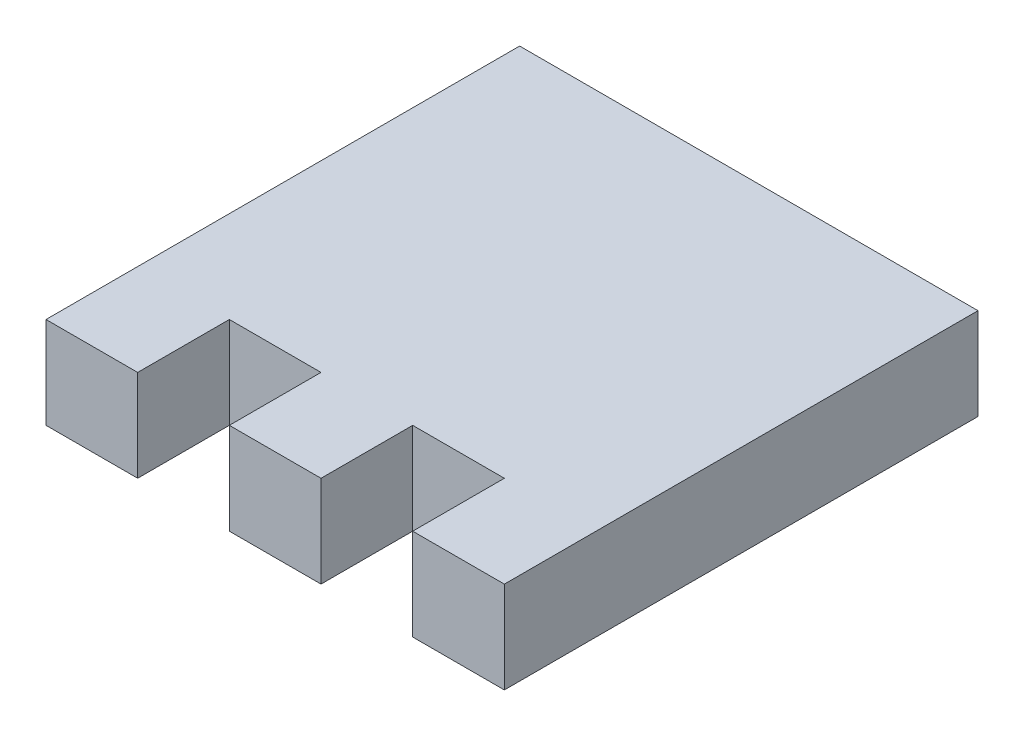
ISO-10303-21;
HEADER;
FILE_DESCRIPTION(('STEP AP214'),'2;1');
FILE_NAME('part.step','',(''),(''),'','','');
FILE_SCHEMA(('AUTOMOTIVE_DESIGN { 1 0 10303 214 1 1 1 1 }'));
ENDSEC;
DATA;
#1=APPLICATION_CONTEXT('core data for automotive mechanical design processes');
#2=APPLICATION_PROTOCOL_DEFINITION('international standard','automotive_design',2000,#1);
#3=PRODUCT_CONTEXT('',#1,'mechanical');
#4=PRODUCT('Part','Part','',(#3));
#5=PRODUCT_RELATED_PRODUCT_CATEGORY('part','',(#4));
#6=PRODUCT_DEFINITION_FORMATION('','',#4);
#7=PRODUCT_DEFINITION_CONTEXT('part definition',#1,'design');
#8=PRODUCT_DEFINITION('design','',#6,#7);
#9=PRODUCT_DEFINITION_SHAPE('','',#8);
#10=(LENGTH_UNIT() NAMED_UNIT(*) SI_UNIT(.MILLI.,.METRE.));
#11=(NAMED_UNIT(*) PLANE_ANGLE_UNIT() SI_UNIT($,.RADIAN.));
#12=(NAMED_UNIT(*) SI_UNIT($,.STERADIAN.) SOLID_ANGLE_UNIT());
#13=UNCERTAINTY_MEASURE_WITH_UNIT(LENGTH_MEASURE(1.E-05),#10,'distance_accuracy_value','');
#14=(GEOMETRIC_REPRESENTATION_CONTEXT(3) GLOBAL_UNCERTAINTY_ASSIGNED_CONTEXT((#13)) GLOBAL_UNIT_ASSIGNED_CONTEXT((#10,
#11,#12)) REPRESENTATION_CONTEXT('',''));
#15=CARTESIAN_POINT('',(0.,0.,0.));
#16=DIRECTION('',(0.,0.,1.));
#17=DIRECTION('',(1.,0.,0.));
#18=AXIS2_PLACEMENT_3D('',#15,#16,#17);
#19=CARTESIAN_POINT('',(7.5,3.,7.75));
#20=DIRECTION('',(-1.,0.,0.));
#21=DIRECTION('',(0.,0.,1.));
#22=AXIS2_PLACEMENT_3D('',#19,#20,#21);
#23=PLANE('',#22);
#24=DIRECTION('',(0.,0.,-1.));
#25=VECTOR('',#24,1.);
#26=CARTESIAN_POINT('',(7.5,0.,7.75));
#27=LINE('',#26,#25);
#28=CARTESIAN_POINT('',(7.5,0.,7.75));
#29=VERTEX_POINT('',#28);
#30=CARTESIAN_POINT('',(7.5,0.,-7.75));
#31=VERTEX_POINT('',#30);
#32=EDGE_CURVE('E156',#29,#31,#27,.T.);
#33=ORIENTED_EDGE('',*,*,#32,.T.);
#34=DIRECTION('',(0.,-1.,0.));
#35=VECTOR('',#34,1.);
#36=CARTESIAN_POINT('',(7.5,3.,-7.75));
#37=LINE('',#36,#35);
#38=CARTESIAN_POINT('',(7.5,3.,-7.75));
#39=VERTEX_POINT('',#38);
#40=EDGE_CURVE('E11',#39,#31,#37,.T.);
#41=ORIENTED_EDGE('',*,*,#40,.F.);
#42=DIRECTION('',(0.,0.,-1.));
#43=VECTOR('',#42,1.);
#44=CARTESIAN_POINT('',(7.5,3.,7.75));
#45=LINE('',#44,#43);
#46=CARTESIAN_POINT('',(7.5,3.,7.75));
#47=VERTEX_POINT('',#46);
#48=EDGE_CURVE('E178',#47,#39,#45,.T.);
#49=ORIENTED_EDGE('',*,*,#48,.F.);
#50=DIRECTION('',(0.,-1.,0.));
#51=VECTOR('',#50,1.);
#52=CARTESIAN_POINT('',(7.5,3.,7.75));
#53=LINE('',#52,#51);
#54=EDGE_CURVE('E152',#47,#29,#53,.T.);
#55=ORIENTED_EDGE('',*,*,#54,.T.);
#56=EDGE_LOOP('',(#33,#41,#49,#55));
#57=FACE_BOUND('',#56,.T.);
#58=ADVANCED_FACE('F36',(#57),#23,.F.);
#59=CARTESIAN_POINT('',(-7.5,3.,-7.75));
#60=DIRECTION('',(0.,0.,1.));
#61=DIRECTION('',(1.,0.,0.));
#62=AXIS2_PLACEMENT_3D('',#59,#60,#61);
#63=PLANE('',#62);
#64=DIRECTION('',(-1.,0.,0.));
#65=VECTOR('',#64,1.);
#66=CARTESIAN_POINT('',(-7.5,0.,-7.75));
#67=LINE('',#66,#65);
#68=CARTESIAN_POINT('',(-7.5,0.,-7.75));
#69=VERTEX_POINT('',#68);
#70=EDGE_CURVE('E159',#31,#69,#67,.T.);
#71=ORIENTED_EDGE('',*,*,#70,.T.);
#72=DIRECTION('',(0.,-1.,0.));
#73=VECTOR('',#72,1.);
#74=CARTESIAN_POINT('',(-7.5,3.,-7.75));
#75=LINE('',#74,#73);
#76=CARTESIAN_POINT('',(-7.5,3.,-7.75));
#77=VERTEX_POINT('',#76);
#78=EDGE_CURVE('E44',#77,#69,#75,.T.);
#79=ORIENTED_EDGE('',*,*,#78,.F.);
#80=DIRECTION('',(-1.,0.,0.));
#81=VECTOR('',#80,1.);
#82=CARTESIAN_POINT('',(-7.5,3.,-7.75));
#83=LINE('',#82,#81);
#84=EDGE_CURVE('E107',#39,#77,#83,.T.);
#85=ORIENTED_EDGE('',*,*,#84,.F.);
#86=ORIENTED_EDGE('',*,*,#40,.T.);
#87=EDGE_LOOP('',(#71,#79,#85,#86));
#88=FACE_BOUND('',#87,.T.);
#89=ADVANCED_FACE('F256',(#88),#63,.F.);
#90=CARTESIAN_POINT('',(-7.5,3.,7.75));
#91=DIRECTION('',(1.,0.,0.));
#92=DIRECTION('',(0.,0.,-1.));
#93=AXIS2_PLACEMENT_3D('',#90,#91,#92);
#94=PLANE('',#93);
#95=DIRECTION('',(0.,0.,1.));
#96=VECTOR('',#95,1.);
#97=CARTESIAN_POINT('',(-7.5,0.,7.75));
#98=LINE('',#97,#96);
#99=CARTESIAN_POINT('',(-7.5,0.,7.75));
#100=VERTEX_POINT('',#99);
#101=EDGE_CURVE('E161',#69,#100,#98,.T.);
#102=ORIENTED_EDGE('',*,*,#101,.T.);
#103=DIRECTION('',(0.,-1.,0.));
#104=VECTOR('',#103,1.);
#105=CARTESIAN_POINT('',(-7.5,3.,7.75));
#106=LINE('',#105,#104);
#107=CARTESIAN_POINT('',(-7.5,3.,7.75));
#108=VERTEX_POINT('',#107);
#109=EDGE_CURVE('E197',#108,#100,#106,.T.);
#110=ORIENTED_EDGE('',*,*,#109,.F.);
#111=DIRECTION('',(0.,0.,1.));
#112=VECTOR('',#111,1.);
#113=CARTESIAN_POINT('',(-7.5,3.,7.75));
#114=LINE('',#113,#112);
#115=EDGE_CURVE('E205',#77,#108,#114,.T.);
#116=ORIENTED_EDGE('',*,*,#115,.F.);
#117=ORIENTED_EDGE('',*,*,#78,.T.);
#118=EDGE_LOOP('',(#102,#110,#116,#117));
#119=FACE_BOUND('',#118,.T.);
#120=ADVANCED_FACE('F203',(#119),#94,.F.);
#121=CARTESIAN_POINT('',(-7.5,3.,7.75));
#122=DIRECTION('',(0.,0.,-1.));
#123=DIRECTION('',(-1.,0.,0.));
#124=AXIS2_PLACEMENT_3D('',#121,#122,#123);
#125=PLANE('',#124);
#126=DIRECTION('',(1.,0.,0.));
#127=VECTOR('',#126,1.);
#128=CARTESIAN_POINT('',(-7.5,0.,7.75));
#129=LINE('',#128,#127);
#130=CARTESIAN_POINT('',(-4.5,0.,7.75));
#131=VERTEX_POINT('',#130);
#132=EDGE_CURVE('E163',#100,#131,#129,.T.);
#133=ORIENTED_EDGE('',*,*,#132,.T.);
#134=DIRECTION('',(0.,-1.,0.));
#135=VECTOR('',#134,1.);
#136=CARTESIAN_POINT('',(-4.5,3.,7.75));
#137=LINE('',#136,#135);
#138=CARTESIAN_POINT('',(-4.5,3.,7.75));
#139=VERTEX_POINT('',#138);
#140=EDGE_CURVE('E194',#139,#131,#137,.T.);
#141=ORIENTED_EDGE('',*,*,#140,.F.);
#142=DIRECTION('',(1.,0.,0.));
#143=VECTOR('',#142,1.);
#144=CARTESIAN_POINT('',(-7.5,3.,7.75));
#145=LINE('',#144,#143);
#146=EDGE_CURVE('E223',#108,#139,#145,.T.);
#147=ORIENTED_EDGE('',*,*,#146,.F.);
#148=ORIENTED_EDGE('',*,*,#109,.T.);
#149=EDGE_LOOP('',(#133,#141,#147,#148));
#150=FACE_BOUND('',#149,.T.);
#151=ADVANCED_FACE('F214',(#150),#125,.F.);
#152=CARTESIAN_POINT('',(-4.5,3.,7.75));
#153=DIRECTION('',(-1.,0.,0.));
#154=DIRECTION('',(0.,0.,1.));
#155=AXIS2_PLACEMENT_3D('',#152,#153,#154);
#156=PLANE('',#155);
#157=DIRECTION('',(0.,0.,-1.));
#158=VECTOR('',#157,1.);
#159=CARTESIAN_POINT('',(-4.5,0.,7.75));
#160=LINE('',#159,#158);
#161=CARTESIAN_POINT('',(-4.5,0.,4.75));
#162=VERTEX_POINT('',#161);
#163=EDGE_CURVE('E165',#131,#162,#160,.T.);
#164=ORIENTED_EDGE('',*,*,#163,.T.);
#165=DIRECTION('',(0.,-1.,0.));
#166=VECTOR('',#165,1.);
#167=CARTESIAN_POINT('',(-4.5,3.,4.75));
#168=LINE('',#167,#166);
#169=CARTESIAN_POINT('',(-4.5,3.,4.75));
#170=VERTEX_POINT('',#169);
#171=EDGE_CURVE('E191',#170,#162,#168,.T.);
#172=ORIENTED_EDGE('',*,*,#171,.F.);
#173=DIRECTION('',(0.,0.,-1.));
#174=VECTOR('',#173,1.);
#175=CARTESIAN_POINT('',(-4.5,3.,7.75));
#176=LINE('',#175,#174);
#177=EDGE_CURVE('E220',#139,#170,#176,.T.);
#178=ORIENTED_EDGE('',*,*,#177,.F.);
#179=ORIENTED_EDGE('',*,*,#140,.T.);
#180=EDGE_LOOP('',(#164,#172,#178,#179));
#181=FACE_BOUND('',#180,.T.);
#182=ADVANCED_FACE('F218',(#181),#156,.F.);
#183=CARTESIAN_POINT('',(-4.5,3.,4.75));
#184=DIRECTION('',(0.,0.,-1.));
#185=DIRECTION('',(-1.,0.,0.));
#186=AXIS2_PLACEMENT_3D('',#183,#184,#185);
#187=PLANE('',#186);
#188=DIRECTION('',(1.,0.,0.));
#189=VECTOR('',#188,1.);
#190=CARTESIAN_POINT('',(-4.5,0.,4.75));
#191=LINE('',#190,#189);
#192=CARTESIAN_POINT('',(-1.5,0.,4.75));
#193=VERTEX_POINT('',#192);
#194=EDGE_CURVE('E167',#162,#193,#191,.T.);
#195=ORIENTED_EDGE('',*,*,#194,.T.);
#196=DIRECTION('',(0.,-1.,0.));
#197=VECTOR('',#196,1.);
#198=CARTESIAN_POINT('',(-1.5,3.,4.75));
#199=LINE('',#198,#197);
#200=CARTESIAN_POINT('',(-1.5,3.,4.75));
#201=VERTEX_POINT('',#200);
#202=EDGE_CURVE('E188',#201,#193,#199,.T.);
#203=ORIENTED_EDGE('',*,*,#202,.F.);
#204=DIRECTION('',(1.,0.,0.));
#205=VECTOR('',#204,1.);
#206=CARTESIAN_POINT('',(-4.5,3.,4.75));
#207=LINE('',#206,#205);
#208=EDGE_CURVE('E222',#170,#201,#207,.T.);
#209=ORIENTED_EDGE('',*,*,#208,.F.);
#210=ORIENTED_EDGE('',*,*,#171,.T.);
#211=EDGE_LOOP('',(#195,#203,#209,#210));
#212=FACE_BOUND('',#211,.T.);
#213=ADVANCED_FACE('F269',(#212),#187,.F.);
#214=CARTESIAN_POINT('',(-1.5,3.,7.75));
#215=DIRECTION('',(1.,0.,0.));
#216=DIRECTION('',(0.,0.,-1.));
#217=AXIS2_PLACEMENT_3D('',#214,#215,#216);
#218=PLANE('',#217);
#219=DIRECTION('',(0.,0.,1.));
#220=VECTOR('',#219,1.);
#221=CARTESIAN_POINT('',(-1.5,0.,7.75));
#222=LINE('',#221,#220);
#223=CARTESIAN_POINT('',(-1.5,0.,7.75));
#224=VERTEX_POINT('',#223);
#225=EDGE_CURVE('E169',#193,#224,#222,.T.);
#226=ORIENTED_EDGE('',*,*,#225,.T.);
#227=DIRECTION('',(0.,-1.,0.));
#228=VECTOR('',#227,1.);
#229=CARTESIAN_POINT('',(-1.5,3.,7.75));
#230=LINE('',#229,#228);
#231=CARTESIAN_POINT('',(-1.5,3.,7.75));
#232=VERTEX_POINT('',#231);
#233=EDGE_CURVE('E185',#232,#224,#230,.T.);
#234=ORIENTED_EDGE('',*,*,#233,.F.);
#235=DIRECTION('',(0.,0.,1.));
#236=VECTOR('',#235,1.);
#237=CARTESIAN_POINT('',(-1.5,3.,7.75));
#238=LINE('',#237,#236);
#239=EDGE_CURVE('E225',#201,#232,#238,.T.);
#240=ORIENTED_EDGE('',*,*,#239,.F.);
#241=ORIENTED_EDGE('',*,*,#202,.T.);
#242=EDGE_LOOP('',(#226,#234,#240,#241));
#243=FACE_BOUND('',#242,.T.);
#244=ADVANCED_FACE('F272',(#243),#218,.F.);
#245=CARTESIAN_POINT('',(-1.5,3.,7.75));
#246=DIRECTION('',(0.,0.,-1.));
#247=DIRECTION('',(-1.,0.,0.));
#248=AXIS2_PLACEMENT_3D('',#245,#246,#247);
#249=PLANE('',#248);
#250=DIRECTION('',(1.,0.,0.));
#251=VECTOR('',#250,1.);
#252=CARTESIAN_POINT('',(-1.5,0.,7.75));
#253=LINE('',#252,#251);
#254=CARTESIAN_POINT('',(1.49999999999999,0.,7.75));
#255=VERTEX_POINT('',#254);
#256=EDGE_CURVE('E171',#224,#255,#253,.T.);
#257=ORIENTED_EDGE('',*,*,#256,.T.);
#258=DIRECTION('',(0.,-1.,0.));
#259=VECTOR('',#258,1.);
#260=CARTESIAN_POINT('',(1.49999999999999,3.,7.75));
#261=LINE('',#260,#259);
#262=CARTESIAN_POINT('',(1.49999999999999,3.,7.75));
#263=VERTEX_POINT('',#262);
#264=EDGE_CURVE('E182',#263,#255,#261,.T.);
#265=ORIENTED_EDGE('',*,*,#264,.F.);
#266=DIRECTION('',(1.,0.,0.));
#267=VECTOR('',#266,1.);
#268=CARTESIAN_POINT('',(-1.5,3.,7.75));
#269=LINE('',#268,#267);
#270=EDGE_CURVE('E231',#232,#263,#269,.T.);
#271=ORIENTED_EDGE('',*,*,#270,.F.);
#272=ORIENTED_EDGE('',*,*,#233,.T.);
#273=EDGE_LOOP('',(#257,#265,#271,#272));
#274=FACE_BOUND('',#273,.T.);
#275=ADVANCED_FACE('F237',(#274),#249,.F.);
#276=CARTESIAN_POINT('',(1.49999999999999,3.,7.75));
#277=DIRECTION('',(-1.,0.,0.));
#278=DIRECTION('',(0.,0.,1.));
#279=AXIS2_PLACEMENT_3D('',#276,#277,#278);
#280=PLANE('',#279);
#281=DIRECTION('',(0.,0.,-1.));
#282=VECTOR('',#281,1.);
#283=CARTESIAN_POINT('',(1.49999999999999,0.,7.75));
#284=LINE('',#283,#282);
#285=CARTESIAN_POINT('',(1.49999999999999,0.,4.75));
#286=VERTEX_POINT('',#285);
#287=EDGE_CURVE('E173',#255,#286,#284,.T.);
#288=ORIENTED_EDGE('',*,*,#287,.T.);
#289=DIRECTION('',(0.,-1.,0.));
#290=VECTOR('',#289,1.);
#291=CARTESIAN_POINT('',(1.49999999999999,3.,4.75));
#292=LINE('',#291,#290);
#293=CARTESIAN_POINT('',(1.49999999999999,3.,4.75));
#294=VERTEX_POINT('',#293);
#295=EDGE_CURVE('E147',#294,#286,#292,.T.);
#296=ORIENTED_EDGE('',*,*,#295,.F.);
#297=DIRECTION('',(0.,0.,-1.));
#298=VECTOR('',#297,1.);
#299=CARTESIAN_POINT('',(1.49999999999999,3.,7.75));
#300=LINE('',#299,#298);
#301=EDGE_CURVE('E138',#263,#294,#300,.T.);
#302=ORIENTED_EDGE('',*,*,#301,.F.);
#303=ORIENTED_EDGE('',*,*,#264,.T.);
#304=EDGE_LOOP('',(#288,#296,#302,#303));
#305=FACE_BOUND('',#304,.T.);
#306=ADVANCED_FACE('F241',(#305),#280,.F.);
#307=CARTESIAN_POINT('',(4.5,3.,4.75));
#308=DIRECTION('',(0.,0.,-1.));
#309=DIRECTION('',(-1.,0.,0.));
#310=AXIS2_PLACEMENT_3D('',#307,#308,#309);
#311=PLANE('',#310);
#312=DIRECTION('',(1.,0.,0.));
#313=VECTOR('',#312,1.);
#314=CARTESIAN_POINT('',(4.5,0.,4.75));
#315=LINE('',#314,#313);
#316=CARTESIAN_POINT('',(4.5,0.,4.75));
#317=VERTEX_POINT('',#316);
#318=EDGE_CURVE('E146',#286,#317,#315,.T.);
#319=ORIENTED_EDGE('',*,*,#318,.T.);
#320=DIRECTION('',(0.,-1.,0.));
#321=VECTOR('',#320,1.);
#322=CARTESIAN_POINT('',(4.5,3.,4.75));
#323=LINE('',#322,#321);
#324=CARTESIAN_POINT('',(4.5,3.,4.75));
#325=VERTEX_POINT('',#324);
#326=EDGE_CURVE('E143',#325,#317,#323,.T.);
#327=ORIENTED_EDGE('',*,*,#326,.F.);
#328=DIRECTION('',(1.,0.,0.));
#329=VECTOR('',#328,1.);
#330=CARTESIAN_POINT('',(4.5,3.,4.75));
#331=LINE('',#330,#329);
#332=EDGE_CURVE('E132',#294,#325,#331,.T.);
#333=ORIENTED_EDGE('',*,*,#332,.F.);
#334=ORIENTED_EDGE('',*,*,#295,.T.);
#335=EDGE_LOOP('',(#319,#327,#333,#334));
#336=FACE_BOUND('',#335,.T.);
#337=ADVANCED_FACE('F144',(#336),#311,.F.);
#338=CARTESIAN_POINT('',(4.5,3.,7.75));
#339=DIRECTION('',(1.,0.,0.));
#340=DIRECTION('',(0.,0.,-1.));
#341=AXIS2_PLACEMENT_3D('',#338,#339,#340);
#342=PLANE('',#341);
#343=DIRECTION('',(0.,0.,1.));
#344=VECTOR('',#343,1.);
#345=CARTESIAN_POINT('',(4.5,0.,7.75));
#346=LINE('',#345,#344);
#347=CARTESIAN_POINT('',(4.5,0.,7.75));
#348=VERTEX_POINT('',#347);
#349=EDGE_CURVE('E93',#317,#348,#346,.T.);
#350=ORIENTED_EDGE('',*,*,#349,.T.);
#351=DIRECTION('',(0.,-1.,0.));
#352=VECTOR('',#351,1.);
#353=CARTESIAN_POINT('',(4.5,3.,7.75));
#354=LINE('',#353,#352);
#355=CARTESIAN_POINT('',(4.5,3.,7.75));
#356=VERTEX_POINT('',#355);
#357=EDGE_CURVE('E148',#356,#348,#354,.T.);
#358=ORIENTED_EDGE('',*,*,#357,.F.);
#359=DIRECTION('',(0.,0.,1.));
#360=VECTOR('',#359,1.);
#361=CARTESIAN_POINT('',(4.5,3.,7.75));
#362=LINE('',#361,#360);
#363=EDGE_CURVE('E136',#325,#356,#362,.T.);
#364=ORIENTED_EDGE('',*,*,#363,.F.);
#365=ORIENTED_EDGE('',*,*,#326,.T.);
#366=EDGE_LOOP('',(#350,#358,#364,#365));
#367=FACE_BOUND('',#366,.T.);
#368=ADVANCED_FACE('F150',(#367),#342,.F.);
#369=CARTESIAN_POINT('',(4.5,3.,7.75));
#370=DIRECTION('',(0.,0.,-1.));
#371=DIRECTION('',(-1.,0.,0.));
#372=AXIS2_PLACEMENT_3D('',#369,#370,#371);
#373=PLANE('',#372);
#374=DIRECTION('',(1.,0.,0.));
#375=VECTOR('',#374,1.);
#376=CARTESIAN_POINT('',(4.5,0.,7.75));
#377=LINE('',#376,#375);
#378=EDGE_CURVE('E99',#348,#29,#377,.T.);
#379=ORIENTED_EDGE('',*,*,#378,.T.);
#380=ORIENTED_EDGE('',*,*,#54,.F.);
#381=DIRECTION('',(1.,0.,0.));
#382=VECTOR('',#381,1.);
#383=CARTESIAN_POINT('',(4.5,3.,7.75));
#384=LINE('',#383,#382);
#385=EDGE_CURVE('E52',#356,#47,#384,.T.);
#386=ORIENTED_EDGE('',*,*,#385,.F.);
#387=ORIENTED_EDGE('',*,*,#357,.T.);
#388=EDGE_LOOP('',(#379,#380,#386,#387));
#389=FACE_BOUND('',#388,.T.);
#390=ADVANCED_FACE('F245',(#389),#373,.F.);
#391=CARTESIAN_POINT('',(0.,3.,0.));
#392=DIRECTION('',(0.,-1.,0.));
#393=DIRECTION('',(0.,0.,-1.));
#394=AXIS2_PLACEMENT_3D('',#391,#392,#393);
#395=PLANE('',#394);
#396=ORIENTED_EDGE('',*,*,#48,.T.);
#397=ORIENTED_EDGE('',*,*,#84,.T.);
#398=ORIENTED_EDGE('',*,*,#115,.T.);
#399=ORIENTED_EDGE('',*,*,#146,.T.);
#400=ORIENTED_EDGE('',*,*,#177,.T.);
#401=ORIENTED_EDGE('',*,*,#208,.T.);
#402=ORIENTED_EDGE('',*,*,#239,.T.);
#403=ORIENTED_EDGE('',*,*,#270,.T.);
#404=ORIENTED_EDGE('',*,*,#301,.T.);
#405=ORIENTED_EDGE('',*,*,#332,.T.);
#406=ORIENTED_EDGE('',*,*,#363,.T.);
#407=ORIENTED_EDGE('',*,*,#385,.T.);
#408=EDGE_LOOP('',(#396,#397,#398,#399,#400,#401,#402,#403,#404,#405,#406,#407));
#409=FACE_BOUND('',#408,.T.);
#410=ADVANCED_FACE('F134',(#409),#395,.F.);
#411=CARTESIAN_POINT('',(0.,0.,0.));
#412=DIRECTION('',(0.,-1.,0.));
#413=DIRECTION('',(0.,0.,-1.));
#414=AXIS2_PLACEMENT_3D('',#411,#412,#413);
#415=PLANE('',#414);
#416=ORIENTED_EDGE('',*,*,#32,.F.);
#417=ORIENTED_EDGE('',*,*,#378,.F.);
#418=ORIENTED_EDGE('',*,*,#349,.F.);
#419=ORIENTED_EDGE('',*,*,#318,.F.);
#420=ORIENTED_EDGE('',*,*,#287,.F.);
#421=ORIENTED_EDGE('',*,*,#256,.F.);
#422=ORIENTED_EDGE('',*,*,#225,.F.);
#423=ORIENTED_EDGE('',*,*,#194,.F.);
#424=ORIENTED_EDGE('',*,*,#163,.F.);
#425=ORIENTED_EDGE('',*,*,#132,.F.);
#426=ORIENTED_EDGE('',*,*,#101,.F.);
#427=ORIENTED_EDGE('',*,*,#70,.F.);
#428=EDGE_LOOP('',(#416,#417,#418,#419,#420,#421,#422,#423,#424,#425,#426,#427));
#429=FACE_BOUND('',#428,.T.);
#430=ADVANCED_FACE('F209',(#429),#415,.T.);
#431=CLOSED_SHELL('',(#58,#89,#120,#151,#182,#213,#244,#275,#306,#337,#368,#390,#410,#430));
#432=MANIFOLD_SOLID_BREP('B2',#431);
#433=ADVANCED_BREP_SHAPE_REPRESENTATION('',(#18,#432),#14);
#434=SHAPE_DEFINITION_REPRESENTATION(#9,#433);
ENDSEC;
END-ISO-10303-21;
